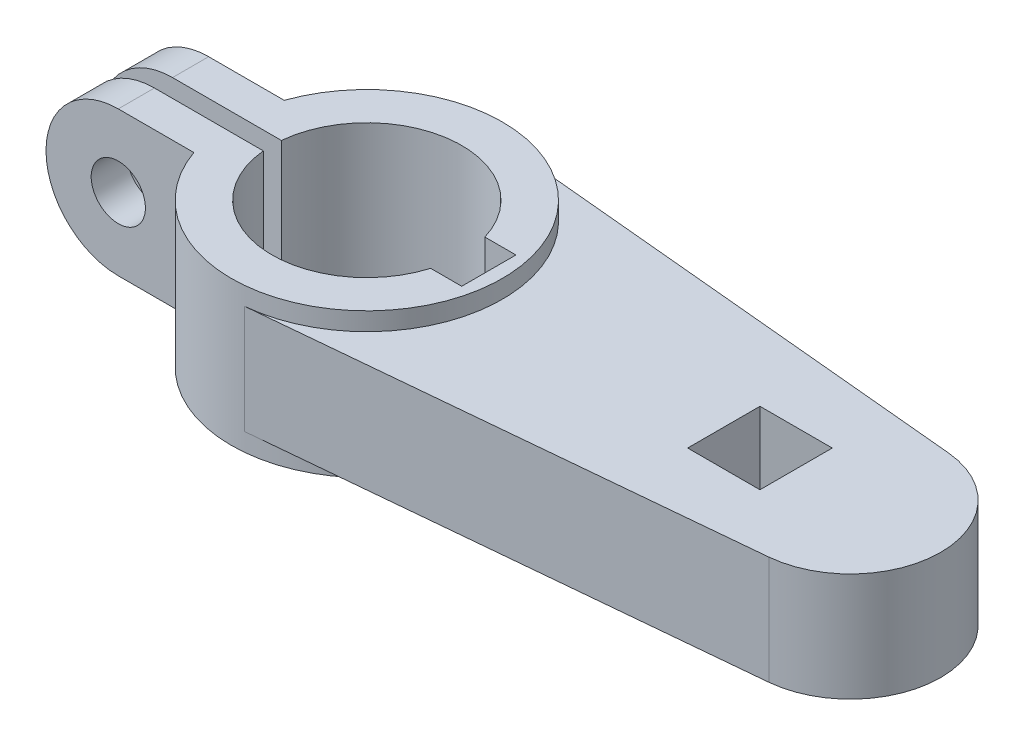
ISO-10303-21;
HEADER;
FILE_DESCRIPTION(('STEP AP214'),'2;1');
FILE_NAME('part.step','',(''),(''),'','','');
FILE_SCHEMA(('AUTOMOTIVE_DESIGN { 1 0 10303 214 1 1 1 1 }'));
ENDSEC;
DATA;
#1=APPLICATION_CONTEXT('core data for automotive mechanical design processes');
#2=APPLICATION_PROTOCOL_DEFINITION('international standard','automotive_design',2000,#1);
#3=PRODUCT_CONTEXT('',#1,'mechanical');
#4=PRODUCT('Part','Part','',(#3));
#5=PRODUCT_RELATED_PRODUCT_CATEGORY('part','',(#4));
#6=PRODUCT_DEFINITION_FORMATION('','',#4);
#7=PRODUCT_DEFINITION_CONTEXT('part definition',#1,'design');
#8=PRODUCT_DEFINITION('design','',#6,#7);
#9=PRODUCT_DEFINITION_SHAPE('','',#8);
#10=(LENGTH_UNIT() NAMED_UNIT(*) SI_UNIT(.MILLI.,.METRE.));
#11=(NAMED_UNIT(*) PLANE_ANGLE_UNIT() SI_UNIT($,.RADIAN.));
#12=(NAMED_UNIT(*) SI_UNIT($,.STERADIAN.) SOLID_ANGLE_UNIT());
#13=UNCERTAINTY_MEASURE_WITH_UNIT(LENGTH_MEASURE(1.E-05),#10,'distance_accuracy_value','');
#14=(GEOMETRIC_REPRESENTATION_CONTEXT(3) GLOBAL_UNCERTAINTY_ASSIGNED_CONTEXT((#13)) GLOBAL_UNIT_ASSIGNED_CONTEXT((#10,
#11,#12)) REPRESENTATION_CONTEXT('',''));
#15=CARTESIAN_POINT('',(0.,0.,0.));
#16=DIRECTION('',(0.,0.,1.));
#17=DIRECTION('',(1.,0.,0.));
#18=AXIS2_PLACEMENT_3D('',#15,#16,#17);
#19=CARTESIAN_POINT('',(0.,6.,0.));
#20=DIRECTION('',(0.,1.,0.));
#21=DIRECTION('',(0.,0.,1.));
#22=AXIS2_PLACEMENT_3D('',#19,#20,#21);
#23=PLANE('',#22);
#24=DIRECTION('',(-0.995623228293348,0.,0.0934579439252336));
#25=VECTOR('',#24,1.);
#26=CARTESIAN_POINT('',(1.4018691588785,6.,14.9343484244002));
#27=LINE('',#26,#25);
#28=CARTESIAN_POINT('',(54.4345794392523,6.,9.95623228293348));
#29=VERTEX_POINT('',#28);
#30=CARTESIAN_POINT('',(1.4018691588785,6.,14.9343484244002));
#31=VERTEX_POINT('',#30);
#32=EDGE_CURVE('E281',#29,#31,#27,.T.);
#33=ORIENTED_EDGE('',*,*,#32,.F.);
#34=CARTESIAN_POINT('',(53.5,6.,0.));
#35=DIRECTION('',(0.,1.,0.));
#36=DIRECTION('',(0.,0.,1.));
#37=AXIS2_PLACEMENT_3D('',#34,#35,#36);
#38=CIRCLE('',#37,10.);
#39=CARTESIAN_POINT('',(54.4345794392523,6.,-9.95623228293348));
#40=VERTEX_POINT('',#39);
#41=EDGE_CURVE('E285',#29,#40,#38,.T.);
#42=ORIENTED_EDGE('',*,*,#41,.T.);
#43=DIRECTION('',(-0.995623228293348,0.,-0.0934579439252336));
#44=VECTOR('',#43,1.);
#45=CARTESIAN_POINT('',(1.4018691588785,6.,-14.9343484244002));
#46=LINE('',#45,#44);
#47=CARTESIAN_POINT('',(1.4018691588785,6.,-14.9343484244002));
#48=VERTEX_POINT('',#47);
#49=EDGE_CURVE('E289',#40,#48,#46,.T.);
#50=ORIENTED_EDGE('',*,*,#49,.T.);
#51=CARTESIAN_POINT('',(0.,6.,0.));
#52=DIRECTION('',(0.,1.,0.));
#53=DIRECTION('',(0.,0.,1.));
#54=AXIS2_PLACEMENT_3D('',#51,#52,#53);
#55=CIRCLE('',#54,15.);
#56=EDGE_CURVE('E293',#31,#48,#55,.T.);
#57=ORIENTED_EDGE('',*,*,#56,.F.);
#58=EDGE_LOOP('',(#33,#42,#50,#57));
#59=FACE_BOUND('',#58,.T.);
#60=DIRECTION('',(0.,0.,-1.));
#61=VECTOR('',#60,1.);
#62=CARTESIAN_POINT('',(47.5,6.,3.99999999999999));
#63=LINE('',#62,#61);
#64=CARTESIAN_POINT('',(47.5,6.,3.99999999999999));
#65=VERTEX_POINT('',#64);
#66=CARTESIAN_POINT('',(47.5,6.,-4.));
#67=VERTEX_POINT('',#66);
#68=EDGE_CURVE('E67',#65,#67,#63,.T.);
#69=ORIENTED_EDGE('',*,*,#68,.F.);
#70=DIRECTION('',(1.,0.,0.));
#71=VECTOR('',#70,1.);
#72=CARTESIAN_POINT('',(39.5,6.,4.));
#73=LINE('',#72,#71);
#74=CARTESIAN_POINT('',(39.5,6.,4.));
#75=VERTEX_POINT('',#74);
#76=EDGE_CURVE('E239',#75,#65,#73,.T.);
#77=ORIENTED_EDGE('',*,*,#76,.F.);
#78=DIRECTION('',(0.,0.,1.));
#79=VECTOR('',#78,1.);
#80=CARTESIAN_POINT('',(39.5,6.,4.));
#81=LINE('',#80,#79);
#82=CARTESIAN_POINT('',(39.5,6.,-4.));
#83=VERTEX_POINT('',#82);
#84=EDGE_CURVE('E229',#83,#75,#81,.T.);
#85=ORIENTED_EDGE('',*,*,#84,.F.);
#86=DIRECTION('',(-1.,0.,0.));
#87=VECTOR('',#86,1.);
#88=CARTESIAN_POINT('',(39.5,6.,-4.));
#89=LINE('',#88,#87);
#90=EDGE_CURVE('E226',#67,#83,#89,.T.);
#91=ORIENTED_EDGE('',*,*,#90,.F.);
#92=EDGE_LOOP('',(#69,#77,#85,#91));
#93=FACE_BOUND('',#92,.T.);
#94=ADVANCED_FACE('F49',(#59,#93),#23,.T.);
#95=CARTESIAN_POINT('',(0.,-6.,0.));
#96=DIRECTION('',(0.,1.,0.));
#97=DIRECTION('',(0.,0.,1.));
#98=AXIS2_PLACEMENT_3D('',#95,#96,#97);
#99=PLANE('',#98);
#100=DIRECTION('',(-0.995623228293348,0.,0.0934579439252336));
#101=VECTOR('',#100,1.);
#102=CARTESIAN_POINT('',(1.4018691588785,-6.,14.9343484244002));
#103=LINE('',#102,#101);
#104=CARTESIAN_POINT('',(54.4345794392523,-6.,9.95623228293348));
#105=VERTEX_POINT('',#104);
#106=CARTESIAN_POINT('',(1.4018691588785,-6.,14.9343484244002));
#107=VERTEX_POINT('',#106);
#108=EDGE_CURVE('E280',#105,#107,#103,.T.);
#109=ORIENTED_EDGE('',*,*,#108,.T.);
#110=CARTESIAN_POINT('',(0.,-6.,0.));
#111=DIRECTION('',(0.,1.,0.));
#112=DIRECTION('',(0.,0.,1.));
#113=AXIS2_PLACEMENT_3D('',#110,#111,#112);
#114=CIRCLE('',#113,15.);
#115=CARTESIAN_POINT('',(1.4018691588785,-6.,-14.9343484244002));
#116=VERTEX_POINT('',#115);
#117=EDGE_CURVE('E286',#107,#116,#114,.T.);
#118=ORIENTED_EDGE('',*,*,#117,.T.);
#119=DIRECTION('',(-0.995623228293348,0.,-0.0934579439252336));
#120=VECTOR('',#119,1.);
#121=CARTESIAN_POINT('',(1.4018691588785,-6.,-14.9343484244002));
#122=LINE('',#121,#120);
#123=CARTESIAN_POINT('',(54.4345794392523,-6.,-9.95623228293348));
#124=VERTEX_POINT('',#123);
#125=EDGE_CURVE('E303',#124,#116,#122,.T.);
#126=ORIENTED_EDGE('',*,*,#125,.F.);
#127=CARTESIAN_POINT('',(53.5,-6.,0.));
#128=DIRECTION('',(0.,1.,0.));
#129=DIRECTION('',(0.,0.,1.));
#130=AXIS2_PLACEMENT_3D('',#127,#128,#129);
#131=CIRCLE('',#130,10.);
#132=EDGE_CURVE('E300',#105,#124,#131,.T.);
#133=ORIENTED_EDGE('',*,*,#132,.F.);
#134=EDGE_LOOP('',(#109,#118,#126,#133));
#135=FACE_BOUND('',#134,.T.);
#136=DIRECTION('',(-1.,0.,0.));
#137=VECTOR('',#136,1.);
#138=CARTESIAN_POINT('',(38.5,-6.,5.));
#139=LINE('',#138,#137);
#140=CARTESIAN_POINT('',(48.5,-6.,5.));
#141=VERTEX_POINT('',#140);
#142=CARTESIAN_POINT('',(38.5,-6.,5.));
#143=VERTEX_POINT('',#142);
#144=EDGE_CURVE('E210',#141,#143,#139,.T.);
#145=ORIENTED_EDGE('',*,*,#144,.F.);
#146=DIRECTION('',(0.,0.,1.));
#147=VECTOR('',#146,1.);
#148=CARTESIAN_POINT('',(48.5,-6.,-5.));
#149=LINE('',#148,#147);
#150=CARTESIAN_POINT('',(48.5,-6.,-5.));
#151=VERTEX_POINT('',#150);
#152=EDGE_CURVE('E203',#151,#141,#149,.T.);
#153=ORIENTED_EDGE('',*,*,#152,.F.);
#154=DIRECTION('',(1.,0.,0.));
#155=VECTOR('',#154,1.);
#156=CARTESIAN_POINT('',(38.5,-6.,-5.));
#157=LINE('',#156,#155);
#158=CARTESIAN_POINT('',(38.5,-6.,-5.));
#159=VERTEX_POINT('',#158);
#160=EDGE_CURVE('E190',#159,#151,#157,.T.);
#161=ORIENTED_EDGE('',*,*,#160,.F.);
#162=DIRECTION('',(0.,0.,-1.));
#163=VECTOR('',#162,1.);
#164=CARTESIAN_POINT('',(38.5,-6.,-5.));
#165=LINE('',#164,#163);
#166=EDGE_CURVE('E75',#143,#159,#165,.T.);
#167=ORIENTED_EDGE('',*,*,#166,.F.);
#168=EDGE_LOOP('',(#145,#153,#161,#167));
#169=FACE_BOUND('',#168,.T.);
#170=ADVANCED_FACE('F208',(#135,#169),#99,.F.);
#171=CARTESIAN_POINT('',(0.,8.,0.999999999999997));
#172=DIRECTION('',(0.,0.,1.));
#173=DIRECTION('',(1.,0.,0.));
#174=AXIS2_PLACEMENT_3D('',#171,#172,#173);
#175=PLANE('',#174);
#176=DIRECTION('',(-1.,0.,0.));
#177=VECTOR('',#176,1.);
#178=CARTESIAN_POINT('',(0.,-8.,0.999999999999997));
#179=LINE('',#178,#177);
#180=CARTESIAN_POINT('',(-10.4522724801834,-8.,0.999999999999997));
#181=VERTEX_POINT('',#180);
#182=CARTESIAN_POINT('',(-22.5,-8.,0.999999999999997));
#183=VERTEX_POINT('',#182);
#184=EDGE_CURVE('E383',#181,#183,#179,.T.);
#185=ORIENTED_EDGE('',*,*,#184,.T.);
#186=CARTESIAN_POINT('',(-22.5,0.,0.999999999999997));
#187=DIRECTION('',(0.,0.,1.));
#188=DIRECTION('',(1.,0.,0.));
#189=AXIS2_PLACEMENT_3D('',#186,#187,#188);
#190=CIRCLE('',#189,8.);
#191=CARTESIAN_POINT('',(-22.5,8.,0.999999999999997));
#192=VERTEX_POINT('',#191);
#193=EDGE_CURVE('E268',#183,#192,#190,.F.);
#194=ORIENTED_EDGE('',*,*,#193,.T.);
#195=DIRECTION('',(-1.,0.,0.));
#196=VECTOR('',#195,1.);
#197=CARTESIAN_POINT('',(0.,8.,0.999999999999997));
#198=LINE('',#197,#196);
#199=CARTESIAN_POINT('',(-10.4522724801834,8.,0.999999999999997));
#200=VERTEX_POINT('',#199);
#201=EDGE_CURVE('E344',#200,#192,#198,.T.);
#202=ORIENTED_EDGE('',*,*,#201,.F.);
#203=DIRECTION('',(0.,-1.,0.));
#204=VECTOR('',#203,1.);
#205=CARTESIAN_POINT('',(-10.4522724801834,8.,0.999999999999997));
#206=LINE('',#205,#204);
#207=EDGE_CURVE('E410',#200,#181,#206,.T.);
#208=ORIENTED_EDGE('',*,*,#207,.T.);
#209=EDGE_LOOP('',(#185,#194,#202,#208));
#210=FACE_BOUND('',#209,.T.);
#211=CARTESIAN_POINT('',(-22.5,0.,0.999999999999997));
#212=DIRECTION('',(0.,0.,1.));
#213=DIRECTION('',(1.,0.,0.));
#214=AXIS2_PLACEMENT_3D('',#211,#212,#213);
#215=CIRCLE('',#214,3.);
#216=CARTESIAN_POINT('',(-19.5,0.,0.999999999999997));
#217=VERTEX_POINT('',#216);
#218=EDGE_CURVE('E276',#217,#217,#215,.T.);
#219=ORIENTED_EDGE('',*,*,#218,.T.);
#220=EDGE_LOOP('',(#219));
#221=FACE_BOUND('',#220,.T.);
#222=ADVANCED_FACE('F456',(#210,#221),#175,.F.);
#223=CARTESIAN_POINT('',(0.,8.,5.));
#224=DIRECTION('',(0.,0.,1.));
#225=DIRECTION('',(1.,0.,0.));
#226=AXIS2_PLACEMENT_3D('',#223,#224,#225);
#227=PLANE('',#226);
#228=CARTESIAN_POINT('',(-22.5,0.,5.));
#229=DIRECTION('',(0.,0.,-1.));
#230=DIRECTION('',(1.,0.,0.));
#231=AXIS2_PLACEMENT_3D('',#228,#229,#230);
#232=CIRCLE('',#231,8.);
#233=CARTESIAN_POINT('',(-22.5,-8.,5.));
#234=VERTEX_POINT('',#233);
#235=CARTESIAN_POINT('',(-22.5,8.,5.));
#236=VERTEX_POINT('',#235);
#237=EDGE_CURVE('E247',#234,#236,#232,.T.);
#238=ORIENTED_EDGE('',*,*,#237,.F.);
#239=DIRECTION('',(-1.,0.,0.));
#240=VECTOR('',#239,1.);
#241=CARTESIAN_POINT('',(0.,-8.,5.));
#242=LINE('',#241,#240);
#243=CARTESIAN_POINT('',(-14.142135623731,-8.,5.));
#244=VERTEX_POINT('',#243);
#245=EDGE_CURVE('E387',#244,#234,#242,.T.);
#246=ORIENTED_EDGE('',*,*,#245,.F.);
#247=DIRECTION('',(0.,-1.,0.));
#248=VECTOR('',#247,1.);
#249=CARTESIAN_POINT('',(-14.142135623731,8.,5.));
#250=LINE('',#249,#248);
#251=CARTESIAN_POINT('',(-14.142135623731,8.,5.));
#252=VERTEX_POINT('',#251);
#253=EDGE_CURVE('E407',#252,#244,#250,.T.);
#254=ORIENTED_EDGE('',*,*,#253,.F.);
#255=DIRECTION('',(-1.,0.,0.));
#256=VECTOR('',#255,1.);
#257=CARTESIAN_POINT('',(0.,8.,5.));
#258=LINE('',#257,#256);
#259=EDGE_CURVE('E348',#252,#236,#258,.T.);
#260=ORIENTED_EDGE('',*,*,#259,.T.);
#261=EDGE_LOOP('',(#238,#246,#254,#260));
#262=FACE_BOUND('',#261,.T.);
#263=CARTESIAN_POINT('',(-22.5,0.,5.));
#264=DIRECTION('',(0.,0.,1.));
#265=DIRECTION('',(1.,0.,0.));
#266=AXIS2_PLACEMENT_3D('',#263,#264,#265);
#267=CIRCLE('',#266,3.);
#268=CARTESIAN_POINT('',(-19.5,0.,5.));
#269=VERTEX_POINT('',#268);
#270=EDGE_CURVE('E242',#269,#269,#267,.T.);
#271=ORIENTED_EDGE('',*,*,#270,.F.);
#272=EDGE_LOOP('',(#271));
#273=FACE_BOUND('',#272,.T.);
#274=ADVANCED_FACE('F445',(#262,#273),#227,.T.);
#275=CARTESIAN_POINT('',(0.,8.,-4.99999999999999));
#276=DIRECTION('',(0.,0.,1.));
#277=DIRECTION('',(1.,0.,0.));
#278=AXIS2_PLACEMENT_3D('',#275,#276,#277);
#279=PLANE('',#278);
#280=DIRECTION('',(-1.,0.,0.));
#281=VECTOR('',#280,1.);
#282=CARTESIAN_POINT('',(0.,-8.,-4.99999999999999));
#283=LINE('',#282,#281);
#284=CARTESIAN_POINT('',(-14.1421356237309,-8.,-5.));
#285=VERTEX_POINT('',#284);
#286=CARTESIAN_POINT('',(-22.5,-8.,-5.));
#287=VERTEX_POINT('',#286);
#288=EDGE_CURVE('E394',#285,#287,#283,.T.);
#289=ORIENTED_EDGE('',*,*,#288,.T.);
#290=CARTESIAN_POINT('',(-22.5,0.,-5.));
#291=DIRECTION('',(0.,0.,1.));
#292=DIRECTION('',(1.,0.,0.));
#293=AXIS2_PLACEMENT_3D('',#290,#291,#292);
#294=CIRCLE('',#293,8.);
#295=CARTESIAN_POINT('',(-22.5,8.,-5.));
#296=VERTEX_POINT('',#295);
#297=EDGE_CURVE('E265',#287,#296,#294,.F.);
#298=ORIENTED_EDGE('',*,*,#297,.T.);
#299=DIRECTION('',(-1.,0.,0.));
#300=VECTOR('',#299,1.);
#301=CARTESIAN_POINT('',(0.,8.,-4.99999999999999));
#302=LINE('',#301,#300);
#303=CARTESIAN_POINT('',(-14.1421356237309,8.,-5.));
#304=VERTEX_POINT('',#303);
#305=EDGE_CURVE('E355',#304,#296,#302,.T.);
#306=ORIENTED_EDGE('',*,*,#305,.F.);
#307=DIRECTION('',(0.,-1.,0.));
#308=VECTOR('',#307,1.);
#309=CARTESIAN_POINT('',(-14.1421356237309,8.,-5.));
#310=LINE('',#309,#308);
#311=EDGE_CURVE('E403',#304,#285,#310,.T.);
#312=ORIENTED_EDGE('',*,*,#311,.T.);
#313=EDGE_LOOP('',(#289,#298,#306,#312));
#314=FACE_BOUND('',#313,.T.);
#315=CARTESIAN_POINT('',(-22.5,0.,-5.));
#316=DIRECTION('',(0.,0.,1.));
#317=DIRECTION('',(1.,0.,0.));
#318=AXIS2_PLACEMENT_3D('',#315,#316,#317);
#319=CIRCLE('',#318,3.);
#320=CARTESIAN_POINT('',(-19.5,0.,-5.));
#321=VERTEX_POINT('',#320);
#322=EDGE_CURVE('E272',#321,#321,#319,.T.);
#323=ORIENTED_EDGE('',*,*,#322,.T.);
#324=EDGE_LOOP('',(#323));
#325=FACE_BOUND('',#324,.T.);
#326=ADVANCED_FACE('F436',(#314,#325),#279,.F.);
#327=CARTESIAN_POINT('',(0.,8.,-1.));
#328=DIRECTION('',(0.,0.,1.));
#329=DIRECTION('',(1.,0.,0.));
#330=AXIS2_PLACEMENT_3D('',#327,#328,#329);
#331=PLANE('',#330);
#332=CARTESIAN_POINT('',(-22.5,0.,-1.));
#333=DIRECTION('',(0.,0.,1.));
#334=DIRECTION('',(1.,0.,0.));
#335=AXIS2_PLACEMENT_3D('',#332,#333,#334);
#336=CIRCLE('',#335,8.);
#337=CARTESIAN_POINT('',(-22.5,-8.,-1.));
#338=VERTEX_POINT('',#337);
#339=CARTESIAN_POINT('',(-22.5,8.,-1.));
#340=VERTEX_POINT('',#339);
#341=EDGE_CURVE('E262',#338,#340,#336,.F.);
#342=ORIENTED_EDGE('',*,*,#341,.F.);
#343=DIRECTION('',(-1.,0.,0.));
#344=VECTOR('',#343,1.);
#345=CARTESIAN_POINT('',(0.,-8.,-1.));
#346=LINE('',#345,#344);
#347=CARTESIAN_POINT('',(-10.4522724801834,-8.,-1.));
#348=VERTEX_POINT('',#347);
#349=EDGE_CURVE('E329',#348,#338,#346,.T.);
#350=ORIENTED_EDGE('',*,*,#349,.F.);
#351=DIRECTION('',(0.,-1.,0.));
#352=VECTOR('',#351,1.);
#353=CARTESIAN_POINT('',(-10.4522724801834,8.,-1.));
#354=LINE('',#353,#352);
#355=CARTESIAN_POINT('',(-10.4522724801834,8.,-1.));
#356=VERTEX_POINT('',#355);
#357=EDGE_CURVE('E363',#356,#348,#354,.T.);
#358=ORIENTED_EDGE('',*,*,#357,.F.);
#359=DIRECTION('',(-1.,0.,0.));
#360=VECTOR('',#359,1.);
#361=CARTESIAN_POINT('',(0.,8.,-1.));
#362=LINE('',#361,#360);
#363=EDGE_CURVE('E359',#356,#340,#362,.T.);
#364=ORIENTED_EDGE('',*,*,#363,.T.);
#365=EDGE_LOOP('',(#342,#350,#358,#364));
#366=FACE_BOUND('',#365,.T.);
#367=CARTESIAN_POINT('',(-22.5,0.,-1.));
#368=DIRECTION('',(0.,0.,1.));
#369=DIRECTION('',(1.,0.,0.));
#370=AXIS2_PLACEMENT_3D('',#367,#368,#369);
#371=CIRCLE('',#370,3.);
#372=CARTESIAN_POINT('',(-19.5,0.,-1.));
#373=VERTEX_POINT('',#372);
#374=EDGE_CURVE('E271',#373,#373,#371,.T.);
#375=ORIENTED_EDGE('',*,*,#374,.F.);
#376=EDGE_LOOP('',(#375));
#377=FACE_BOUND('',#376,.T.);
#378=ADVANCED_FACE('F434',(#366,#377),#331,.T.);
#379=CARTESIAN_POINT('',(0.,8.,0.));
#380=DIRECTION('',(0.,-1.,0.));
#381=DIRECTION('',(0.,0.,-1.));
#382=AXIS2_PLACEMENT_3D('',#379,#380,#381);
#383=CYLINDRICAL_SURFACE('',#382,10.5);
#384=CARTESIAN_POINT('',(0.,-8.,0.));
#385=DIRECTION('',(0.,1.,0.));
#386=DIRECTION('',(0.,0.,1.));
#387=AXIS2_PLACEMENT_3D('',#384,#385,#386);
#388=CIRCLE('',#387,10.5);
#389=CARTESIAN_POINT('',(10.0623058987491,-8.,-3.));
#390=VERTEX_POINT('',#389);
#391=EDGE_CURVE('E323',#390,#348,#388,.T.);
#392=ORIENTED_EDGE('',*,*,#391,.F.);
#393=DIRECTION('',(0.,-1.,0.));
#394=VECTOR('',#393,1.);
#395=CARTESIAN_POINT('',(10.0623058987491,8.,-3.));
#396=LINE('',#395,#394);
#397=CARTESIAN_POINT('',(10.0623058987491,8.,-3.));
#398=VERTEX_POINT('',#397);
#399=EDGE_CURVE('E422',#398,#390,#396,.T.);
#400=ORIENTED_EDGE('',*,*,#399,.F.);
#401=CARTESIAN_POINT('',(0.,8.,0.));
#402=DIRECTION('',(0.,1.,0.));
#403=DIRECTION('',(0.,0.,1.));
#404=AXIS2_PLACEMENT_3D('',#401,#402,#403);
#405=CIRCLE('',#404,10.5);
#406=EDGE_CURVE('E324',#398,#356,#405,.T.);
#407=ORIENTED_EDGE('',*,*,#406,.T.);
#408=ORIENTED_EDGE('',*,*,#357,.T.);
#409=EDGE_LOOP('',(#392,#400,#407,#408));
#410=FACE_BOUND('',#409,.T.);
#411=ADVANCED_FACE('F51',(#410),#383,.F.);
#412=CARTESIAN_POINT('',(0.,8.,-3.));
#413=DIRECTION('',(0.,0.,-1.));
#414=DIRECTION('',(-1.,0.,0.));
#415=AXIS2_PLACEMENT_3D('',#412,#413,#414);
#416=PLANE('',#415);
#417=DIRECTION('',(1.,0.,0.));
#418=VECTOR('',#417,1.);
#419=CARTESIAN_POINT('',(0.,-8.,-3.));
#420=LINE('',#419,#418);
#421=CARTESIAN_POINT('',(13.5,-8.,-3.));
#422=VERTEX_POINT('',#421);
#423=EDGE_CURVE('E367',#390,#422,#420,.T.);
#424=ORIENTED_EDGE('',*,*,#423,.T.);
#425=DIRECTION('',(0.,-1.,0.));
#426=VECTOR('',#425,1.);
#427=CARTESIAN_POINT('',(13.5,8.,-3.));
#428=LINE('',#427,#426);
#429=CARTESIAN_POINT('',(13.5,8.,-3.));
#430=VERTEX_POINT('',#429);
#431=EDGE_CURVE('E419',#430,#422,#428,.T.);
#432=ORIENTED_EDGE('',*,*,#431,.F.);
#433=DIRECTION('',(1.,0.,0.));
#434=VECTOR('',#433,1.);
#435=CARTESIAN_POINT('',(0.,8.,-3.));
#436=LINE('',#435,#434);
#437=EDGE_CURVE('E328',#398,#430,#436,.T.);
#438=ORIENTED_EDGE('',*,*,#437,.F.);
#439=ORIENTED_EDGE('',*,*,#399,.T.);
#440=EDGE_LOOP('',(#424,#432,#438,#439));
#441=FACE_BOUND('',#440,.T.);
#442=ADVANCED_FACE('F443',(#441),#416,.F.);
#443=CARTESIAN_POINT('',(13.5,8.,0.));
#444=DIRECTION('',(-1.,0.,0.));
#445=DIRECTION('',(0.,0.,1.));
#446=AXIS2_PLACEMENT_3D('',#443,#444,#445);
#447=PLANE('',#446);
#448=DIRECTION('',(0.,0.,-1.));
#449=VECTOR('',#448,1.);
#450=CARTESIAN_POINT('',(13.5,-8.,0.));
#451=LINE('',#450,#449);
#452=CARTESIAN_POINT('',(13.5,-8.,3.));
#453=VERTEX_POINT('',#452);
#454=EDGE_CURVE('E371',#453,#422,#451,.T.);
#455=ORIENTED_EDGE('',*,*,#454,.F.);
#456=DIRECTION('',(0.,-1.,0.));
#457=VECTOR('',#456,1.);
#458=CARTESIAN_POINT('',(13.5,8.,3.));
#459=LINE('',#458,#457);
#460=CARTESIAN_POINT('',(13.5,8.,3.));
#461=VERTEX_POINT('',#460);
#462=EDGE_CURVE('E416',#461,#453,#459,.T.);
#463=ORIENTED_EDGE('',*,*,#462,.F.);
#464=DIRECTION('',(0.,0.,-1.));
#465=VECTOR('',#464,1.);
#466=CARTESIAN_POINT('',(13.5,8.,0.));
#467=LINE('',#466,#465);
#468=EDGE_CURVE('E332',#461,#430,#467,.T.);
#469=ORIENTED_EDGE('',*,*,#468,.T.);
#470=ORIENTED_EDGE('',*,*,#431,.T.);
#471=EDGE_LOOP('',(#455,#463,#469,#470));
#472=FACE_BOUND('',#471,.T.);
#473=ADVANCED_FACE('F513',(#472),#447,.T.);
#474=CARTESIAN_POINT('',(0.,8.,3.));
#475=DIRECTION('',(0.,0.,-1.));
#476=DIRECTION('',(-1.,0.,0.));
#477=AXIS2_PLACEMENT_3D('',#474,#475,#476);
#478=PLANE('',#477);
#479=DIRECTION('',(1.,0.,0.));
#480=VECTOR('',#479,1.);
#481=CARTESIAN_POINT('',(0.,-8.,3.));
#482=LINE('',#481,#480);
#483=CARTESIAN_POINT('',(10.0623058987491,-8.,3.));
#484=VERTEX_POINT('',#483);
#485=EDGE_CURVE('E375',#484,#453,#482,.T.);
#486=ORIENTED_EDGE('',*,*,#485,.F.);
#487=DIRECTION('',(0.,-1.,0.));
#488=VECTOR('',#487,1.);
#489=CARTESIAN_POINT('',(10.0623058987491,8.,3.));
#490=LINE('',#489,#488);
#491=CARTESIAN_POINT('',(10.0623058987491,8.,3.));
#492=VERTEX_POINT('',#491);
#493=EDGE_CURVE('E413',#492,#484,#490,.T.);
#494=ORIENTED_EDGE('',*,*,#493,.F.);
#495=DIRECTION('',(1.,0.,0.));
#496=VECTOR('',#495,1.);
#497=CARTESIAN_POINT('',(0.,8.,3.));
#498=LINE('',#497,#496);
#499=EDGE_CURVE('E336',#492,#461,#498,.T.);
#500=ORIENTED_EDGE('',*,*,#499,.T.);
#501=ORIENTED_EDGE('',*,*,#462,.T.);
#502=EDGE_LOOP('',(#486,#494,#500,#501));
#503=FACE_BOUND('',#502,.T.);
#504=ADVANCED_FACE('F508',(#503),#478,.T.);
#505=CARTESIAN_POINT('',(0.,8.,0.));
#506=DIRECTION('',(0.,-1.,0.));
#507=DIRECTION('',(0.,0.,-1.));
#508=AXIS2_PLACEMENT_3D('',#505,#506,#507);
#509=CYLINDRICAL_SURFACE('',#508,10.5);
#510=CARTESIAN_POINT('',(0.,-8.,0.));
#511=DIRECTION('',(0.,1.,0.));
#512=DIRECTION('',(0.,0.,1.));
#513=AXIS2_PLACEMENT_3D('',#510,#511,#512);
#514=CIRCLE('',#513,10.5);
#515=EDGE_CURVE('E379',#181,#484,#514,.T.);
#516=ORIENTED_EDGE('',*,*,#515,.F.);
#517=ORIENTED_EDGE('',*,*,#207,.F.);
#518=CARTESIAN_POINT('',(0.,8.,0.));
#519=DIRECTION('',(0.,1.,0.));
#520=DIRECTION('',(0.,0.,1.));
#521=AXIS2_PLACEMENT_3D('',#518,#519,#520);
#522=CIRCLE('',#521,10.5);
#523=EDGE_CURVE('E340',#200,#492,#522,.T.);
#524=ORIENTED_EDGE('',*,*,#523,.T.);
#525=ORIENTED_EDGE('',*,*,#493,.T.);
#526=EDGE_LOOP('',(#516,#517,#524,#525));
#527=FACE_BOUND('',#526,.T.);
#528=ADVANCED_FACE('F504',(#527),#509,.F.);
#529=CARTESIAN_POINT('',(0.,8.,0.));
#530=DIRECTION('',(0.,-1.,0.));
#531=DIRECTION('',(0.,0.,-1.));
#532=AXIS2_PLACEMENT_3D('',#529,#530,#531);
#533=CYLINDRICAL_SURFACE('',#532,15.);
#534=DIRECTION('',(0.,-1.,0.));
#535=VECTOR('',#534,1.);
#536=CARTESIAN_POINT('',(1.4018691588785,6.,14.9343484244002));
#537=LINE('',#536,#535);
#538=EDGE_CURVE('E296',#31,#107,#537,.T.);
#539=ORIENTED_EDGE('',*,*,#538,.F.);
#540=ORIENTED_EDGE('',*,*,#56,.T.);
#541=DIRECTION('',(0.,-1.,0.));
#542=VECTOR('',#541,1.);
#543=CARTESIAN_POINT('',(1.4018691588785,6.,-14.9343484244002));
#544=LINE('',#543,#542);
#545=EDGE_CURVE('E313',#48,#116,#544,.T.);
#546=ORIENTED_EDGE('',*,*,#545,.T.);
#547=ORIENTED_EDGE('',*,*,#117,.F.);
#548=EDGE_LOOP('',(#539,#540,#546,#547));
#549=FACE_BOUND('',#548,.T.);
#550=CARTESIAN_POINT('',(0.,-8.,0.));
#551=DIRECTION('',(0.,1.,0.));
#552=DIRECTION('',(0.,0.,1.));
#553=AXIS2_PLACEMENT_3D('',#550,#551,#552);
#554=CIRCLE('',#553,15.);
#555=EDGE_CURVE('E391',#244,#285,#554,.T.);
#556=ORIENTED_EDGE('',*,*,#555,.T.);
#557=ORIENTED_EDGE('',*,*,#311,.F.);
#558=CARTESIAN_POINT('',(0.,8.,0.));
#559=DIRECTION('',(0.,1.,0.));
#560=DIRECTION('',(0.,0.,1.));
#561=AXIS2_PLACEMENT_3D('',#558,#559,#560);
#562=CIRCLE('',#561,15.);
#563=EDGE_CURVE('E352',#252,#304,#562,.T.);
#564=ORIENTED_EDGE('',*,*,#563,.F.);
#565=ORIENTED_EDGE('',*,*,#253,.T.);
#566=EDGE_LOOP('',(#556,#557,#564,#565));
#567=FACE_BOUND('',#566,.T.);
#568=ADVANCED_FACE('F481',(#549,#567),#533,.T.);
#569=CARTESIAN_POINT('',(0.,8.,0.));
#570=DIRECTION('',(0.,1.,0.));
#571=DIRECTION('',(0.,0.,1.));
#572=AXIS2_PLACEMENT_3D('',#569,#570,#571);
#573=PLANE('',#572);
#574=DIRECTION('',(0.,0.,1.));
#575=VECTOR('',#574,1.);
#576=CARTESIAN_POINT('',(-22.5,8.,-7.));
#577=LINE('',#576,#575);
#578=EDGE_CURVE('E252',#192,#236,#577,.T.);
#579=ORIENTED_EDGE('',*,*,#578,.T.);
#580=ORIENTED_EDGE('',*,*,#259,.F.);
#581=ORIENTED_EDGE('',*,*,#563,.T.);
#582=ORIENTED_EDGE('',*,*,#305,.T.);
#583=EDGE_CURVE('E261',#296,#340,#577,.T.);
#584=ORIENTED_EDGE('',*,*,#583,.T.);
#585=ORIENTED_EDGE('',*,*,#363,.F.);
#586=ORIENTED_EDGE('',*,*,#406,.F.);
#587=ORIENTED_EDGE('',*,*,#437,.T.);
#588=ORIENTED_EDGE('',*,*,#468,.F.);
#589=ORIENTED_EDGE('',*,*,#499,.F.);
#590=ORIENTED_EDGE('',*,*,#523,.F.);
#591=ORIENTED_EDGE('',*,*,#201,.T.);
#592=EDGE_LOOP('',(#579,#580,#581,#582,#584,#585,#586,#587,#588,#589,#590,#591));
#593=FACE_BOUND('',#592,.T.);
#594=ADVANCED_FACE('F479',(#593),#573,.T.);
#595=CARTESIAN_POINT('',(0.,-8.,0.));
#596=DIRECTION('',(0.,1.,0.));
#597=DIRECTION('',(0.,0.,1.));
#598=AXIS2_PLACEMENT_3D('',#595,#596,#597);
#599=PLANE('',#598);
#600=ORIENTED_EDGE('',*,*,#245,.T.);
#601=DIRECTION('',(0.,0.,-1.));
#602=VECTOR('',#601,1.);
#603=CARTESIAN_POINT('',(-22.5,-8.,0.));
#604=LINE('',#603,#602);
#605=EDGE_CURVE('E12',#234,#183,#604,.T.);
#606=ORIENTED_EDGE('',*,*,#605,.T.);
#607=ORIENTED_EDGE('',*,*,#184,.F.);
#608=ORIENTED_EDGE('',*,*,#515,.T.);
#609=ORIENTED_EDGE('',*,*,#485,.T.);
#610=ORIENTED_EDGE('',*,*,#454,.T.);
#611=ORIENTED_EDGE('',*,*,#423,.F.);
#612=ORIENTED_EDGE('',*,*,#391,.T.);
#613=ORIENTED_EDGE('',*,*,#349,.T.);
#614=EDGE_CURVE('E59',#338,#287,#604,.T.);
#615=ORIENTED_EDGE('',*,*,#614,.T.);
#616=ORIENTED_EDGE('',*,*,#288,.F.);
#617=ORIENTED_EDGE('',*,*,#555,.F.);
#618=EDGE_LOOP('',(#600,#606,#607,#608,#609,#610,#611,#612,#613,#615,#616,#617));
#619=FACE_BOUND('',#618,.T.);
#620=ADVANCED_FACE('F477',(#619),#599,.F.);
#621=CARTESIAN_POINT('',(1.4018691588785,6.,14.9343484244002));
#622=DIRECTION('',(0.0934579439252336,0.,0.995623228293348));
#623=DIRECTION('',(0.995623228293348,0.,-0.0934579439252336));
#624=AXIS2_PLACEMENT_3D('',#621,#622,#623);
#625=PLANE('',#624);
#626=ORIENTED_EDGE('',*,*,#108,.F.);
#627=DIRECTION('',(0.,-1.,0.));
#628=VECTOR('',#627,1.);
#629=CARTESIAN_POINT('',(54.4345794392523,6.,9.95623228293348));
#630=LINE('',#629,#628);
#631=EDGE_CURVE('E320',#29,#105,#630,.T.);
#632=ORIENTED_EDGE('',*,*,#631,.F.);
#633=ORIENTED_EDGE('',*,*,#32,.T.);
#634=ORIENTED_EDGE('',*,*,#538,.T.);
#635=EDGE_LOOP('',(#626,#632,#633,#634));
#636=FACE_BOUND('',#635,.T.);
#637=ADVANCED_FACE('F473',(#636),#625,.T.);
#638=CARTESIAN_POINT('',(53.5,6.,0.));
#639=DIRECTION('',(0.,-1.,0.));
#640=DIRECTION('',(0.,0.,-1.));
#641=AXIS2_PLACEMENT_3D('',#638,#639,#640);
#642=CYLINDRICAL_SURFACE('',#641,10.);
#643=ORIENTED_EDGE('',*,*,#132,.T.);
#644=DIRECTION('',(0.,-1.,0.));
#645=VECTOR('',#644,1.);
#646=CARTESIAN_POINT('',(54.4345794392523,6.,-9.95623228293348));
#647=LINE('',#646,#645);
#648=EDGE_CURVE('E316',#40,#124,#647,.T.);
#649=ORIENTED_EDGE('',*,*,#648,.F.);
#650=ORIENTED_EDGE('',*,*,#41,.F.);
#651=ORIENTED_EDGE('',*,*,#631,.T.);
#652=EDGE_LOOP('',(#643,#649,#650,#651));
#653=FACE_BOUND('',#652,.T.);
#654=ADVANCED_FACE('F469',(#653),#642,.T.);
#655=CARTESIAN_POINT('',(1.4018691588785,6.,-14.9343484244002));
#656=DIRECTION('',(-0.0934579439252336,0.,0.995623228293348));
#657=DIRECTION('',(0.995623228293348,0.,0.0934579439252336));
#658=AXIS2_PLACEMENT_3D('',#655,#656,#657);
#659=PLANE('',#658);
#660=ORIENTED_EDGE('',*,*,#125,.T.);
#661=ORIENTED_EDGE('',*,*,#545,.F.);
#662=ORIENTED_EDGE('',*,*,#49,.F.);
#663=ORIENTED_EDGE('',*,*,#648,.T.);
#664=EDGE_LOOP('',(#660,#661,#662,#663));
#665=FACE_BOUND('',#664,.T.);
#666=ADVANCED_FACE('F465',(#665),#659,.F.);
#667=CARTESIAN_POINT('',(-22.5,0.,-7.));
#668=DIRECTION('',(0.,0.,1.));
#669=DIRECTION('',(1.,0.,0.));
#670=AXIS2_PLACEMENT_3D('',#667,#668,#669);
#671=CYLINDRICAL_SURFACE('',#670,8.);
#672=ORIENTED_EDGE('',*,*,#614,.F.);
#673=ORIENTED_EDGE('',*,*,#341,.T.);
#674=ORIENTED_EDGE('',*,*,#583,.F.);
#675=ORIENTED_EDGE('',*,*,#297,.F.);
#676=EDGE_LOOP('',(#672,#673,#674,#675));
#677=FACE_BOUND('',#676,.T.);
#678=ADVANCED_FACE('F468',(#677),#671,.T.);
#679=ORIENTED_EDGE('',*,*,#605,.F.);
#680=ORIENTED_EDGE('',*,*,#237,.T.);
#681=ORIENTED_EDGE('',*,*,#578,.F.);
#682=ORIENTED_EDGE('',*,*,#193,.F.);
#683=EDGE_LOOP('',(#679,#680,#681,#682));
#684=FACE_BOUND('',#683,.T.);
#685=ADVANCED_FACE('F462',(#684),#671,.T.);
#686=CARTESIAN_POINT('',(-22.5,0.,-7.));
#687=DIRECTION('',(0.,0.,1.));
#688=DIRECTION('',(1.,0.,0.));
#689=AXIS2_PLACEMENT_3D('',#686,#687,#688);
#690=CYLINDRICAL_SURFACE('',#689,3.);
#691=ORIENTED_EDGE('',*,*,#374,.T.);
#692=EDGE_LOOP('',(#691));
#693=FACE_BOUND('',#692,.T.);
#694=ORIENTED_EDGE('',*,*,#322,.F.);
#695=EDGE_LOOP('',(#694));
#696=FACE_BOUND('',#695,.T.);
#697=ADVANCED_FACE('F431',(#693,#696),#690,.F.);
#698=ORIENTED_EDGE('',*,*,#270,.T.);
#699=EDGE_LOOP('',(#698));
#700=FACE_BOUND('',#699,.T.);
#701=ORIENTED_EDGE('',*,*,#218,.F.);
#702=EDGE_LOOP('',(#701));
#703=FACE_BOUND('',#702,.T.);
#704=ADVANCED_FACE('F638',(#700,#703),#690,.F.);
#705=CARTESIAN_POINT('',(0.,0.372413793103451,4.46896551724139));
#706=DIRECTION('',(0.,-0.0830454798537403,-0.99654575824488));
#707=DIRECTION('',(0.,0.99654575824488,-0.0830454798537403));
#708=AXIS2_PLACEMENT_3D('',#705,#706,#707);
#709=PLANE('',#708);
#710=DIRECTION('',(-0.0827605888602363,0.993127066322842,-0.0827605888602372));
#711=VECTOR('',#710,1.);
#712=CARTESIAN_POINT('',(48.5,-6.,5.));
#713=LINE('',#712,#711);
#714=EDGE_CURVE('E199',#141,#65,#713,.T.);
#715=ORIENTED_EDGE('',*,*,#714,.F.);
#716=ORIENTED_EDGE('',*,*,#144,.T.);
#717=DIRECTION('',(0.0827605888602374,0.993127066322841,-0.082760588860237));
#718=VECTOR('',#717,1.);
#719=CARTESIAN_POINT('',(38.5,-6.,5.));
#720=LINE('',#719,#718);
#721=EDGE_CURVE('E206',#143,#75,#720,.T.);
#722=ORIENTED_EDGE('',*,*,#721,.T.);
#723=ORIENTED_EDGE('',*,*,#76,.T.);
#724=EDGE_LOOP('',(#715,#716,#722,#723));
#725=FACE_BOUND('',#724,.T.);
#726=ADVANCED_FACE('F645',(#725),#709,.T.);
#727=CARTESIAN_POINT('',(38.7310344827586,-3.22758620689658,0.));
#728=DIRECTION('',(0.99654575824488,-0.0830454798537406,0.));
#729=DIRECTION('',(0.0830454798537406,0.99654575824488,0.));
#730=AXIS2_PLACEMENT_3D('',#727,#728,#729);
#731=PLANE('',#730);
#732=ORIENTED_EDGE('',*,*,#721,.F.);
#733=ORIENTED_EDGE('',*,*,#166,.T.);
#734=DIRECTION('',(0.0827605888602374,0.993127066322841,0.0827605888602366));
#735=VECTOR('',#734,1.);
#736=CARTESIAN_POINT('',(38.5,-6.,-5.));
#737=LINE('',#736,#735);
#738=EDGE_CURVE('E195',#159,#83,#737,.T.);
#739=ORIENTED_EDGE('',*,*,#738,.T.);
#740=ORIENTED_EDGE('',*,*,#84,.T.);
#741=EDGE_LOOP('',(#732,#733,#739,#740));
#742=FACE_BOUND('',#741,.T.);
#743=ADVANCED_FACE('F664',(#742),#731,.T.);
#744=CARTESIAN_POINT('',(47.6689655172414,3.97241379310343,0.));
#745=DIRECTION('',(-0.99654575824488,-0.0830454798537395,0.));
#746=DIRECTION('',(0.0830454798537395,-0.99654575824488,0.));
#747=AXIS2_PLACEMENT_3D('',#744,#745,#746);
#748=PLANE('',#747);
#749=DIRECTION('',(-0.0827605888602363,0.993127066322842,0.0827605888602365));
#750=VECTOR('',#749,1.);
#751=CARTESIAN_POINT('',(48.5,-6.,-5.));
#752=LINE('',#751,#750);
#753=EDGE_CURVE('E193',#151,#67,#752,.T.);
#754=ORIENTED_EDGE('',*,*,#753,.F.);
#755=ORIENTED_EDGE('',*,*,#152,.T.);
#756=ORIENTED_EDGE('',*,*,#714,.T.);
#757=ORIENTED_EDGE('',*,*,#68,.T.);
#758=EDGE_LOOP('',(#754,#755,#756,#757));
#759=FACE_BOUND('',#758,.T.);
#760=ADVANCED_FACE('F202',(#759),#748,.T.);
#761=CARTESIAN_POINT('',(0.,0.372413793103447,-4.46896551724138));
#762=DIRECTION('',(0.,-0.0830454798537398,0.99654575824488));
#763=DIRECTION('',(0.,-0.99654575824488,-0.0830454798537398));
#764=AXIS2_PLACEMENT_3D('',#761,#762,#763);
#765=PLANE('',#764);
#766=ORIENTED_EDGE('',*,*,#738,.F.);
#767=ORIENTED_EDGE('',*,*,#160,.T.);
#768=ORIENTED_EDGE('',*,*,#753,.T.);
#769=ORIENTED_EDGE('',*,*,#90,.T.);
#770=EDGE_LOOP('',(#766,#767,#768,#769));
#771=FACE_BOUND('',#770,.T.);
#772=ADVANCED_FACE('F191',(#771),#765,.T.);
#773=CLOSED_SHELL('',(#94,#170,#222,#274,#326,#378,#411,#442,#473,#504,#528,#568,#594,#620,#637,
#654,#666,#678,#685,#697,#704,#726,#743,#760,#772));
#774=MANIFOLD_SOLID_BREP('B2',#773);
#775=ADVANCED_BREP_SHAPE_REPRESENTATION('',(#18,#774),#14);
#776=SHAPE_DEFINITION_REPRESENTATION(#9,#775);
ENDSEC;
END-ISO-10303-21;
